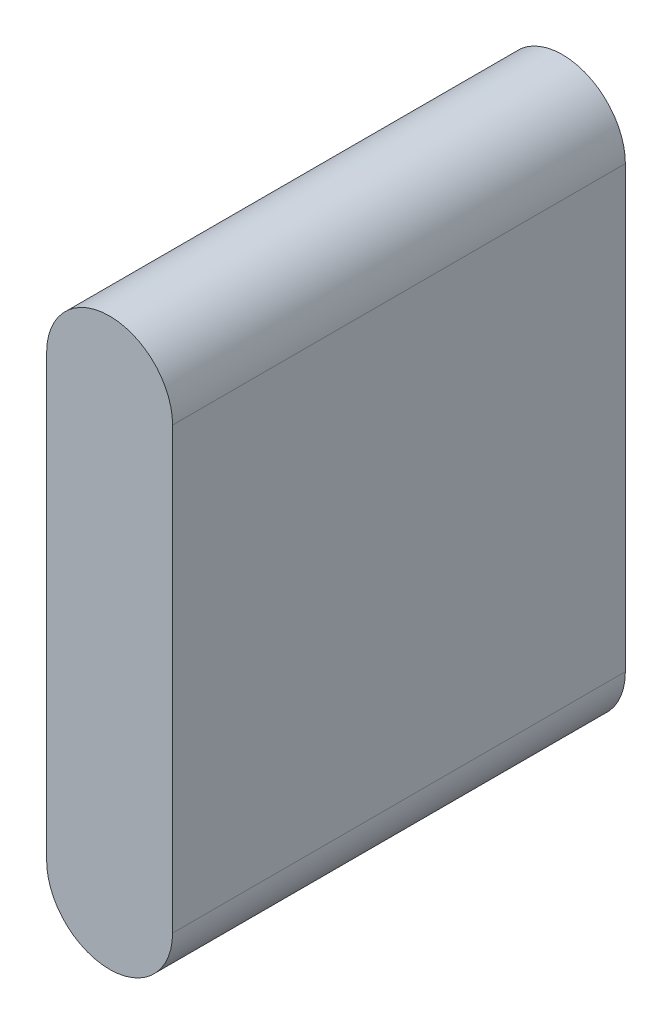
ISO-10303-21;
HEADER;
FILE_DESCRIPTION(('STEP AP214'),'2;1');
FILE_NAME('part.step','',(''),(''),'','','');
FILE_SCHEMA(('AUTOMOTIVE_DESIGN { 1 0 10303 214 1 1 1 1 }'));
ENDSEC;
DATA;
#1=APPLICATION_CONTEXT('core data for automotive mechanical design processes');
#2=APPLICATION_PROTOCOL_DEFINITION('international standard','automotive_design',2000,#1);
#3=PRODUCT_CONTEXT('',#1,'mechanical');
#4=PRODUCT('Part','Part','',(#3));
#5=PRODUCT_RELATED_PRODUCT_CATEGORY('part','',(#4));
#6=PRODUCT_DEFINITION_FORMATION('','',#4);
#7=PRODUCT_DEFINITION_CONTEXT('part definition',#1,'design');
#8=PRODUCT_DEFINITION('design','',#6,#7);
#9=PRODUCT_DEFINITION_SHAPE('','',#8);
#10=(LENGTH_UNIT() NAMED_UNIT(*) SI_UNIT(.MILLI.,.METRE.));
#11=(NAMED_UNIT(*) PLANE_ANGLE_UNIT() SI_UNIT($,.RADIAN.));
#12=(NAMED_UNIT(*) SI_UNIT($,.STERADIAN.) SOLID_ANGLE_UNIT());
#13=UNCERTAINTY_MEASURE_WITH_UNIT(LENGTH_MEASURE(1.E-05),#10,'distance_accuracy_value','');
#14=(GEOMETRIC_REPRESENTATION_CONTEXT(3) GLOBAL_UNCERTAINTY_ASSIGNED_CONTEXT((#13)) GLOBAL_UNIT_ASSIGNED_CONTEXT((#10,
#11,#12)) REPRESENTATION_CONTEXT('',''));
#15=CARTESIAN_POINT('',(0.,0.,0.));
#16=DIRECTION('',(0.,0.,1.));
#17=DIRECTION('',(1.,0.,0.));
#18=AXIS2_PLACEMENT_3D('',#15,#16,#17);
#19=CARTESIAN_POINT('',(-22.25,0.,0.));
#20=DIRECTION('',(1.,0.,0.));
#21=DIRECTION('',(0.,0.,-1.));
#22=AXIS2_PLACEMENT_3D('',#19,#20,#21);
#23=PLANE('',#22);
#24=DIRECTION('',(0.,0.,-1.));
#25=VECTOR('',#24,1.);
#26=CARTESIAN_POINT('',(-22.25,30.5752322815721,51.9208316817145));
#27=LINE('',#26,#25);
#28=CARTESIAN_POINT('',(-22.25,30.5752322815721,51.9208316817145));
#29=VERTEX_POINT('',#28);
#30=CARTESIAN_POINT('',(-22.25,30.5752322815721,-28.0791683182855));
#31=VERTEX_POINT('',#30);
#32=EDGE_CURVE('E75',#29,#31,#27,.T.);
#33=ORIENTED_EDGE('',*,*,#32,.T.);
#34=DIRECTION('',(0.,1.,0.));
#35=VECTOR('',#34,1.);
#36=CARTESIAN_POINT('',(-22.25,41.7052322815721,-28.0791683182855));
#37=LINE('',#36,#35);
#38=CARTESIAN_POINT('',(-22.25,-47.1647677184279,-28.0791683182855));
#39=VERTEX_POINT('',#38);
#40=EDGE_CURVE('E11',#39,#31,#37,.T.);
#41=ORIENTED_EDGE('',*,*,#40,.F.);
#42=DIRECTION('',(0.,0.,-1.));
#43=VECTOR('',#42,1.);
#44=CARTESIAN_POINT('',(-22.25,-47.1647677184279,51.9208316817145));
#45=LINE('',#44,#43);
#46=CARTESIAN_POINT('',(-22.25,-47.1647677184279,51.9208316817145));
#47=VERTEX_POINT('',#46);
#48=EDGE_CURVE('E91',#47,#39,#45,.T.);
#49=ORIENTED_EDGE('',*,*,#48,.F.);
#50=DIRECTION('',(0.,-1.,0.));
#51=VECTOR('',#50,1.);
#52=CARTESIAN_POINT('',(-22.25,41.7052322815721,51.9208316817145));
#53=LINE('',#52,#51);
#54=EDGE_CURVE('E42',#29,#47,#53,.T.);
#55=ORIENTED_EDGE('',*,*,#54,.F.);
#56=EDGE_LOOP('',(#33,#41,#49,#55));
#57=FACE_BOUND('',#56,.T.);
#58=ADVANCED_FACE('F33',(#57),#23,.F.);
#59=CARTESIAN_POINT('',(0.,0.,0.));
#60=DIRECTION('',(1.,0.,0.));
#61=DIRECTION('',(0.,0.,-1.));
#62=AXIS2_PLACEMENT_3D('',#59,#60,#61);
#63=PLANE('',#62);
#64=DIRECTION('',(0.,1.,0.));
#65=VECTOR('',#64,1.);
#66=CARTESIAN_POINT('',(0.,41.7052322815721,-28.0791683182855));
#67=LINE('',#66,#65);
#68=CARTESIAN_POINT('',(0.,-47.1647677184279,-28.0791683182855));
#69=VERTEX_POINT('',#68);
#70=CARTESIAN_POINT('',(0.,30.5752322815721,-28.0791683182855));
#71=VERTEX_POINT('',#70);
#72=EDGE_CURVE('E37',#69,#71,#67,.T.);
#73=ORIENTED_EDGE('',*,*,#72,.T.);
#74=DIRECTION('',(0.,0.,-1.));
#75=VECTOR('',#74,1.);
#76=CARTESIAN_POINT('',(0.,30.5752322815721,51.9208316817145));
#77=LINE('',#76,#75);
#78=CARTESIAN_POINT('',(0.,30.5752322815721,51.9208316817145));
#79=VERTEX_POINT('',#78);
#80=EDGE_CURVE('E82',#79,#71,#77,.T.);
#81=ORIENTED_EDGE('',*,*,#80,.F.);
#82=DIRECTION('',(0.,-1.,0.));
#83=VECTOR('',#82,1.);
#84=CARTESIAN_POINT('',(0.,41.7052322815721,51.9208316817145));
#85=LINE('',#84,#83);
#86=CARTESIAN_POINT('',(0.,-47.1647677184279,51.9208316817145));
#87=VERTEX_POINT('',#86);
#88=EDGE_CURVE('E88',#79,#87,#85,.T.);
#89=ORIENTED_EDGE('',*,*,#88,.T.);
#90=DIRECTION('',(0.,0.,-1.));
#91=VECTOR('',#90,1.);
#92=CARTESIAN_POINT('',(0.,-47.1647677184279,51.9208316817145));
#93=LINE('',#92,#91);
#94=EDGE_CURVE('E96',#87,#69,#93,.T.);
#95=ORIENTED_EDGE('',*,*,#94,.T.);
#96=EDGE_LOOP('',(#73,#81,#89,#95));
#97=FACE_BOUND('',#96,.T.);
#98=ADVANCED_FACE('F106',(#97),#63,.T.);
#99=CARTESIAN_POINT('',(-22.25,41.7052322815721,51.9208316817145));
#100=DIRECTION('',(0.,0.,1.));
#101=DIRECTION('',(0.,-1.,0.));
#102=AXIS2_PLACEMENT_3D('',#99,#100,#101);
#103=PLANE('',#102);
#104=CARTESIAN_POINT('',(-11.125,30.5752322815721,51.9208316817145));
#105=DIRECTION('',(0.,0.,1.));
#106=DIRECTION('',(0.,1.,0.));
#107=AXIS2_PLACEMENT_3D('',#104,#105,#106);
#108=CIRCLE('',#107,11.125);
#109=EDGE_CURVE('E50',#79,#29,#108,.T.);
#110=ORIENTED_EDGE('',*,*,#109,.T.);
#111=ORIENTED_EDGE('',*,*,#54,.T.);
#112=CARTESIAN_POINT('',(-11.125,-47.1647677184279,51.9208316817145));
#113=DIRECTION('',(0.,0.,1.));
#114=DIRECTION('',(0.,-1.,0.));
#115=AXIS2_PLACEMENT_3D('',#112,#113,#114);
#116=CIRCLE('',#115,11.125);
#117=EDGE_CURVE('E99',#47,#87,#116,.T.);
#118=ORIENTED_EDGE('',*,*,#117,.T.);
#119=ORIENTED_EDGE('',*,*,#88,.F.);
#120=EDGE_LOOP('',(#110,#111,#118,#119));
#121=FACE_BOUND('',#120,.T.);
#122=ADVANCED_FACE('F35',(#121),#103,.T.);
#123=CARTESIAN_POINT('',(-22.25,41.7052322815721,-28.0791683182855));
#124=DIRECTION('',(0.,0.,-1.));
#125=DIRECTION('',(0.,1.,0.));
#126=AXIS2_PLACEMENT_3D('',#123,#124,#125);
#127=PLANE('',#126);
#128=CARTESIAN_POINT('',(-11.125,30.5752322815721,-28.0791683182855));
#129=DIRECTION('',(0.,0.,1.));
#130=DIRECTION('',(0.,1.,0.));
#131=AXIS2_PLACEMENT_3D('',#128,#129,#130);
#132=CIRCLE('',#131,11.125);
#133=EDGE_CURVE('E78',#71,#31,#132,.T.);
#134=ORIENTED_EDGE('',*,*,#133,.F.);
#135=ORIENTED_EDGE('',*,*,#72,.F.);
#136=CARTESIAN_POINT('',(-11.125,-47.1647677184279,-28.0791683182855));
#137=DIRECTION('',(0.,0.,1.));
#138=DIRECTION('',(0.,-1.,0.));
#139=AXIS2_PLACEMENT_3D('',#136,#137,#138);
#140=CIRCLE('',#139,11.125);
#141=EDGE_CURVE('E58',#39,#69,#140,.T.);
#142=ORIENTED_EDGE('',*,*,#141,.F.);
#143=ORIENTED_EDGE('',*,*,#40,.T.);
#144=EDGE_LOOP('',(#134,#135,#142,#143));
#145=FACE_BOUND('',#144,.T.);
#146=ADVANCED_FACE('F105',(#145),#127,.T.);
#147=CARTESIAN_POINT('',(-11.125,-47.1647677184279,51.9208316817145));
#148=DIRECTION('',(0.,0.,-1.));
#149=DIRECTION('',(0.,1.,0.));
#150=AXIS2_PLACEMENT_3D('',#147,#148,#149);
#151=CYLINDRICAL_SURFACE('',#150,11.125);
#152=ORIENTED_EDGE('',*,*,#141,.T.);
#153=ORIENTED_EDGE('',*,*,#94,.F.);
#154=ORIENTED_EDGE('',*,*,#117,.F.);
#155=ORIENTED_EDGE('',*,*,#48,.T.);
#156=EDGE_LOOP('',(#152,#153,#154,#155));
#157=FACE_BOUND('',#156,.T.);
#158=ADVANCED_FACE('F116',(#157),#151,.T.);
#159=CARTESIAN_POINT('',(-11.125,30.5752322815721,51.9208316817145));
#160=DIRECTION('',(0.,0.,-1.));
#161=DIRECTION('',(0.,1.,0.));
#162=AXIS2_PLACEMENT_3D('',#159,#160,#161);
#163=CYLINDRICAL_SURFACE('',#162,11.125);
#164=ORIENTED_EDGE('',*,*,#133,.T.);
#165=ORIENTED_EDGE('',*,*,#32,.F.);
#166=ORIENTED_EDGE('',*,*,#109,.F.);
#167=ORIENTED_EDGE('',*,*,#80,.T.);
#168=EDGE_LOOP('',(#164,#165,#166,#167));
#169=FACE_BOUND('',#168,.T.);
#170=ADVANCED_FACE('F76',(#169),#163,.T.);
#171=CLOSED_SHELL('',(#58,#98,#122,#146,#158,#170));
#172=MANIFOLD_SOLID_BREP('B2',#171);
#173=ADVANCED_BREP_SHAPE_REPRESENTATION('',(#18,#172),#14);
#174=SHAPE_DEFINITION_REPRESENTATION(#9,#173);
ENDSEC;
END-ISO-10303-21;
